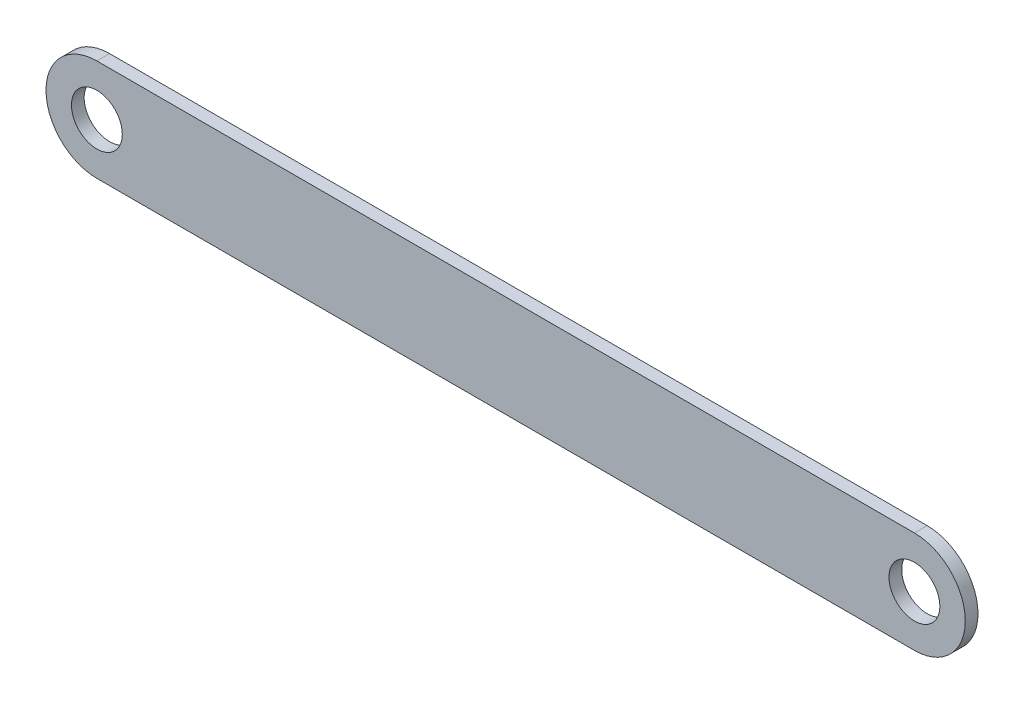
ISO-10303-21;
HEADER;
FILE_DESCRIPTION(('STEP AP214'),'2;1');
FILE_NAME('part.step','',(''),(''),'','','');
FILE_SCHEMA(('AUTOMOTIVE_DESIGN { 1 0 10303 214 1 1 1 1 }'));
ENDSEC;
DATA;
#1=APPLICATION_CONTEXT('core data for automotive mechanical design processes');
#2=APPLICATION_PROTOCOL_DEFINITION('international standard','automotive_design',2000,#1);
#3=PRODUCT_CONTEXT('',#1,'mechanical');
#4=PRODUCT('Part','Part','',(#3));
#5=PRODUCT_RELATED_PRODUCT_CATEGORY('part','',(#4));
#6=PRODUCT_DEFINITION_FORMATION('','',#4);
#7=PRODUCT_DEFINITION_CONTEXT('part definition',#1,'design');
#8=PRODUCT_DEFINITION('design','',#6,#7);
#9=PRODUCT_DEFINITION_SHAPE('','',#8);
#10=(LENGTH_UNIT() NAMED_UNIT(*) SI_UNIT(.MILLI.,.METRE.));
#11=(NAMED_UNIT(*) PLANE_ANGLE_UNIT() SI_UNIT($,.RADIAN.));
#12=(NAMED_UNIT(*) SI_UNIT($,.STERADIAN.) SOLID_ANGLE_UNIT());
#13=UNCERTAINTY_MEASURE_WITH_UNIT(LENGTH_MEASURE(1.E-05),#10,'distance_accuracy_value','');
#14=(GEOMETRIC_REPRESENTATION_CONTEXT(3) GLOBAL_UNCERTAINTY_ASSIGNED_CONTEXT((#13)) GLOBAL_UNIT_ASSIGNED_CONTEXT((#10,
#11,#12)) REPRESENTATION_CONTEXT('',''));
#15=CARTESIAN_POINT('',(0.,0.,0.));
#16=DIRECTION('',(0.,0.,1.));
#17=DIRECTION('',(1.,0.,0.));
#18=AXIS2_PLACEMENT_3D('',#15,#16,#17);
#19=CARTESIAN_POINT('',(0.,0.,5.));
#20=DIRECTION('',(0.,0.,1.));
#21=DIRECTION('',(1.,0.,0.));
#22=AXIS2_PLACEMENT_3D('',#19,#20,#21);
#23=PLANE('',#22);
#24=CARTESIAN_POINT('',(0.,0.,5.));
#25=DIRECTION('',(0.,0.,1.));
#26=DIRECTION('',(1.,0.,0.));
#27=AXIS2_PLACEMENT_3D('',#24,#25,#26);
#28=CIRCLE('',#27,10.);
#29=CARTESIAN_POINT('',(10.,0.,5.));
#30=VERTEX_POINT('',#29);
#31=EDGE_CURVE('E112',#30,#30,#28,.T.);
#32=ORIENTED_EDGE('',*,*,#31,.F.);
#33=EDGE_LOOP('',(#32));
#34=FACE_BOUND('',#33,.T.);
#35=CARTESIAN_POINT('',(0.,0.,5.));
#36=DIRECTION('',(0.,0.,1.));
#37=DIRECTION('',(1.,0.,0.));
#38=AXIS2_PLACEMENT_3D('',#35,#36,#37);
#39=CIRCLE('',#38,20.);
#40=CARTESIAN_POINT('',(0.,20.,5.));
#41=VERTEX_POINT('',#40);
#42=CARTESIAN_POINT('',(0.,-20.,5.));
#43=VERTEX_POINT('',#42);
#44=EDGE_CURVE('E92',#41,#43,#39,.T.);
#45=ORIENTED_EDGE('',*,*,#44,.T.);
#46=DIRECTION('',(1.,0.,0.));
#47=VECTOR('',#46,1.);
#48=CARTESIAN_POINT('',(0.,-20.,5.));
#49=LINE('',#48,#47);
#50=CARTESIAN_POINT('',(321.517448030049,-20.,5.));
#51=VERTEX_POINT('',#50);
#52=EDGE_CURVE('E87',#43,#51,#49,.T.);
#53=ORIENTED_EDGE('',*,*,#52,.T.);
#54=CARTESIAN_POINT('',(321.517448030049,0.,5.));
#55=DIRECTION('',(0.,0.,1.));
#56=DIRECTION('',(1.,0.,0.));
#57=AXIS2_PLACEMENT_3D('',#54,#55,#56);
#58=CIRCLE('',#57,20.);
#59=CARTESIAN_POINT('',(321.517448030049,20.,5.));
#60=VERTEX_POINT('',#59);
#61=EDGE_CURVE('E90',#51,#60,#58,.T.);
#62=ORIENTED_EDGE('',*,*,#61,.T.);
#63=DIRECTION('',(-1.,0.,0.));
#64=VECTOR('',#63,1.);
#65=CARTESIAN_POINT('',(0.,20.,5.));
#66=LINE('',#65,#64);
#67=EDGE_CURVE('E57',#60,#41,#66,.T.);
#68=ORIENTED_EDGE('',*,*,#67,.T.);
#69=EDGE_LOOP('',(#45,#53,#62,#68));
#70=FACE_BOUND('',#69,.T.);
#71=CARTESIAN_POINT('',(321.517448030049,0.,5.));
#72=DIRECTION('',(0.,0.,1.));
#73=DIRECTION('',(1.,0.,0.));
#74=AXIS2_PLACEMENT_3D('',#71,#72,#73);
#75=CIRCLE('',#74,10.);
#76=CARTESIAN_POINT('',(331.517448030049,0.,5.));
#77=VERTEX_POINT('',#76);
#78=EDGE_CURVE('E134',#77,#77,#75,.T.);
#79=ORIENTED_EDGE('',*,*,#78,.F.);
#80=EDGE_LOOP('',(#79));
#81=FACE_BOUND('',#80,.T.);
#82=ADVANCED_FACE('F39',(#34,#70,#81),#23,.T.);
#83=CARTESIAN_POINT('',(0.,0.,0.));
#84=DIRECTION('',(0.,0.,1.));
#85=DIRECTION('',(1.,0.,0.));
#86=AXIS2_PLACEMENT_3D('',#83,#84,#85);
#87=PLANE('',#86);
#88=CARTESIAN_POINT('',(0.,0.,0.));
#89=DIRECTION('',(0.,0.,1.));
#90=DIRECTION('',(1.,0.,0.));
#91=AXIS2_PLACEMENT_3D('',#88,#89,#90);
#92=CIRCLE('',#91,20.);
#93=CARTESIAN_POINT('',(0.,20.,0.));
#94=VERTEX_POINT('',#93);
#95=CARTESIAN_POINT('',(0.,-20.,0.));
#96=VERTEX_POINT('',#95);
#97=EDGE_CURVE('E108',#94,#96,#92,.T.);
#98=ORIENTED_EDGE('',*,*,#97,.F.);
#99=DIRECTION('',(-1.,0.,0.));
#100=VECTOR('',#99,1.);
#101=CARTESIAN_POINT('',(0.,20.,0.));
#102=LINE('',#101,#100);
#103=CARTESIAN_POINT('',(321.517448030049,20.,0.));
#104=VERTEX_POINT('',#103);
#105=EDGE_CURVE('E80',#104,#94,#102,.T.);
#106=ORIENTED_EDGE('',*,*,#105,.F.);
#107=CARTESIAN_POINT('',(321.517448030049,0.,0.));
#108=DIRECTION('',(0.,0.,1.));
#109=DIRECTION('',(1.,0.,0.));
#110=AXIS2_PLACEMENT_3D('',#107,#108,#109);
#111=CIRCLE('',#110,20.);
#112=CARTESIAN_POINT('',(321.517448030049,-20.,0.));
#113=VERTEX_POINT('',#112);
#114=EDGE_CURVE('E74',#113,#104,#111,.T.);
#115=ORIENTED_EDGE('',*,*,#114,.F.);
#116=DIRECTION('',(1.,0.,0.));
#117=VECTOR('',#116,1.);
#118=CARTESIAN_POINT('',(0.,-20.,0.));
#119=LINE('',#118,#117);
#120=EDGE_CURVE('E97',#96,#113,#119,.T.);
#121=ORIENTED_EDGE('',*,*,#120,.F.);
#122=EDGE_LOOP('',(#98,#106,#115,#121));
#123=FACE_BOUND('',#122,.T.);
#124=CARTESIAN_POINT('',(0.,0.,0.));
#125=DIRECTION('',(0.,0.,1.));
#126=DIRECTION('',(1.,0.,0.));
#127=AXIS2_PLACEMENT_3D('',#124,#125,#126);
#128=CIRCLE('',#127,10.);
#129=CARTESIAN_POINT('',(10.,0.,0.));
#130=VERTEX_POINT('',#129);
#131=EDGE_CURVE('E130',#130,#130,#128,.T.);
#132=ORIENTED_EDGE('',*,*,#131,.T.);
#133=EDGE_LOOP('',(#132));
#134=FACE_BOUND('',#133,.T.);
#135=CARTESIAN_POINT('',(321.517448030049,0.,0.));
#136=DIRECTION('',(0.,0.,1.));
#137=DIRECTION('',(1.,0.,0.));
#138=AXIS2_PLACEMENT_3D('',#135,#136,#137);
#139=CIRCLE('',#138,10.);
#140=CARTESIAN_POINT('',(331.517448030049,0.,0.));
#141=VERTEX_POINT('',#140);
#142=EDGE_CURVE('E138',#141,#141,#139,.T.);
#143=ORIENTED_EDGE('',*,*,#142,.T.);
#144=EDGE_LOOP('',(#143));
#145=FACE_BOUND('',#144,.T.);
#146=ADVANCED_FACE('F125',(#123,#134,#145),#87,.F.);
#147=CARTESIAN_POINT('',(0.,0.,5.));
#148=DIRECTION('',(0.,0.,-1.));
#149=DIRECTION('',(-1.,0.,0.));
#150=AXIS2_PLACEMENT_3D('',#147,#148,#149);
#151=CYLINDRICAL_SURFACE('',#150,20.);
#152=ORIENTED_EDGE('',*,*,#97,.T.);
#153=DIRECTION('',(0.,0.,-1.));
#154=VECTOR('',#153,1.);
#155=CARTESIAN_POINT('',(0.,-20.,5.));
#156=LINE('',#155,#154);
#157=EDGE_CURVE('E11',#43,#96,#156,.T.);
#158=ORIENTED_EDGE('',*,*,#157,.F.);
#159=ORIENTED_EDGE('',*,*,#44,.F.);
#160=DIRECTION('',(0.,0.,-1.));
#161=VECTOR('',#160,1.);
#162=CARTESIAN_POINT('',(0.,20.,5.));
#163=LINE('',#162,#161);
#164=EDGE_CURVE('E104',#41,#94,#163,.T.);
#165=ORIENTED_EDGE('',*,*,#164,.T.);
#166=EDGE_LOOP('',(#152,#158,#159,#165));
#167=FACE_BOUND('',#166,.T.);
#168=ADVANCED_FACE('F41',(#167),#151,.T.);
#169=CARTESIAN_POINT('',(0.,-20.,5.));
#170=DIRECTION('',(0.,1.,0.));
#171=DIRECTION('',(0.,0.,1.));
#172=AXIS2_PLACEMENT_3D('',#169,#170,#171);
#173=PLANE('',#172);
#174=ORIENTED_EDGE('',*,*,#120,.T.);
#175=DIRECTION('',(0.,0.,-1.));
#176=VECTOR('',#175,1.);
#177=CARTESIAN_POINT('',(321.517448030049,-20.,5.));
#178=LINE('',#177,#176);
#179=EDGE_CURVE('E49',#51,#113,#178,.T.);
#180=ORIENTED_EDGE('',*,*,#179,.F.);
#181=ORIENTED_EDGE('',*,*,#52,.F.);
#182=ORIENTED_EDGE('',*,*,#157,.T.);
#183=EDGE_LOOP('',(#174,#180,#181,#182));
#184=FACE_BOUND('',#183,.T.);
#185=ADVANCED_FACE('F96',(#184),#173,.F.);
#186=CARTESIAN_POINT('',(321.517448030049,0.,5.));
#187=DIRECTION('',(0.,0.,-1.));
#188=DIRECTION('',(-1.,0.,0.));
#189=AXIS2_PLACEMENT_3D('',#186,#187,#188);
#190=CYLINDRICAL_SURFACE('',#189,20.);
#191=ORIENTED_EDGE('',*,*,#114,.T.);
#192=DIRECTION('',(0.,0.,-1.));
#193=VECTOR('',#192,1.);
#194=CARTESIAN_POINT('',(321.517448030049,20.,5.));
#195=LINE('',#194,#193);
#196=EDGE_CURVE('E99',#60,#104,#195,.T.);
#197=ORIENTED_EDGE('',*,*,#196,.F.);
#198=ORIENTED_EDGE('',*,*,#61,.F.);
#199=ORIENTED_EDGE('',*,*,#179,.T.);
#200=EDGE_LOOP('',(#191,#197,#198,#199));
#201=FACE_BOUND('',#200,.T.);
#202=ADVANCED_FACE('F100',(#201),#190,.T.);
#203=CARTESIAN_POINT('',(0.,20.,5.));
#204=DIRECTION('',(0.,-1.,0.));
#205=DIRECTION('',(0.,0.,-1.));
#206=AXIS2_PLACEMENT_3D('',#203,#204,#205);
#207=PLANE('',#206);
#208=ORIENTED_EDGE('',*,*,#105,.T.);
#209=ORIENTED_EDGE('',*,*,#164,.F.);
#210=ORIENTED_EDGE('',*,*,#67,.F.);
#211=ORIENTED_EDGE('',*,*,#196,.T.);
#212=EDGE_LOOP('',(#208,#209,#210,#211));
#213=FACE_BOUND('',#212,.T.);
#214=ADVANCED_FACE('F122',(#213),#207,.F.);
#215=CARTESIAN_POINT('',(0.,0.,5.));
#216=DIRECTION('',(0.,0.,-1.));
#217=DIRECTION('',(-1.,0.,0.));
#218=AXIS2_PLACEMENT_3D('',#215,#216,#217);
#219=CYLINDRICAL_SURFACE('',#218,10.);
#220=ORIENTED_EDGE('',*,*,#31,.T.);
#221=EDGE_LOOP('',(#220));
#222=FACE_BOUND('',#221,.T.);
#223=ORIENTED_EDGE('',*,*,#131,.F.);
#224=EDGE_LOOP('',(#223));
#225=FACE_BOUND('',#224,.T.);
#226=ADVANCED_FACE('F157',(#222,#225),#219,.F.);
#227=CARTESIAN_POINT('',(321.517448030049,0.,5.));
#228=DIRECTION('',(0.,0.,-1.));
#229=DIRECTION('',(-1.,0.,0.));
#230=AXIS2_PLACEMENT_3D('',#227,#228,#229);
#231=CYLINDRICAL_SURFACE('',#230,10.);
#232=ORIENTED_EDGE('',*,*,#78,.T.);
#233=EDGE_LOOP('',(#232));
#234=FACE_BOUND('',#233,.T.);
#235=ORIENTED_EDGE('',*,*,#142,.F.);
#236=EDGE_LOOP('',(#235));
#237=FACE_BOUND('',#236,.T.);
#238=ADVANCED_FACE('F146',(#234,#237),#231,.F.);
#239=CLOSED_SHELL('',(#82,#146,#168,#185,#202,#214,#226,#238));
#240=MANIFOLD_SOLID_BREP('B2',#239);
#241=ADVANCED_BREP_SHAPE_REPRESENTATION('',(#18,#240),#14);
#242=SHAPE_DEFINITION_REPRESENTATION(#9,#241);
ENDSEC;
END-ISO-10303-21;
